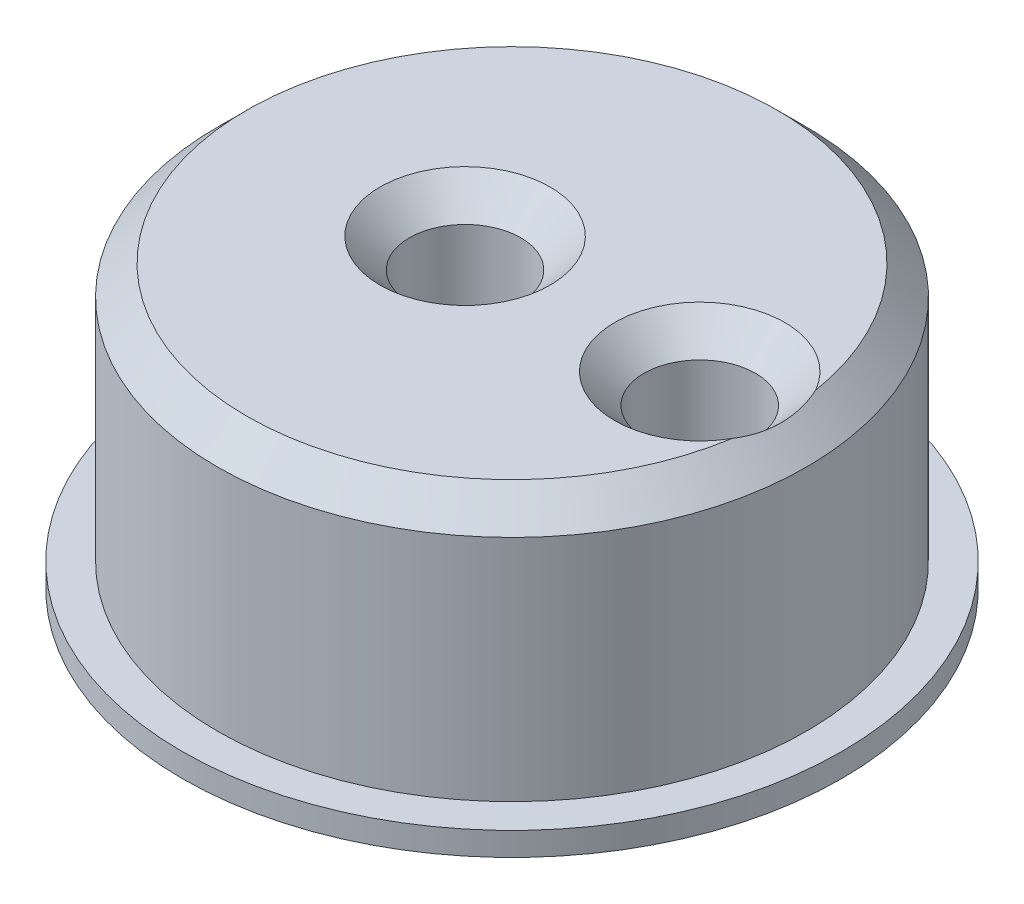
ISO-10303-21;
HEADER;
FILE_DESCRIPTION(('STEP AP214'),'2;1');
FILE_NAME('part.step','',(''),(''),'','','');
FILE_SCHEMA(('AUTOMOTIVE_DESIGN { 1 0 10303 214 1 1 1 1 }'));
ENDSEC;
DATA;
#1=APPLICATION_CONTEXT('core data for automotive mechanical design processes');
#2=APPLICATION_PROTOCOL_DEFINITION('international standard','automotive_design',2000,#1);
#3=PRODUCT_CONTEXT('',#1,'mechanical');
#4=PRODUCT('Part','Part','',(#3));
#5=PRODUCT_RELATED_PRODUCT_CATEGORY('part','',(#4));
#6=PRODUCT_DEFINITION_FORMATION('','',#4);
#7=PRODUCT_DEFINITION_CONTEXT('part definition',#1,'design');
#8=PRODUCT_DEFINITION('design','',#6,#7);
#9=PRODUCT_DEFINITION_SHAPE('','',#8);
#10=(LENGTH_UNIT() NAMED_UNIT(*) SI_UNIT(.MILLI.,.METRE.));
#11=(NAMED_UNIT(*) PLANE_ANGLE_UNIT() SI_UNIT($,.RADIAN.));
#12=(NAMED_UNIT(*) SI_UNIT($,.STERADIAN.) SOLID_ANGLE_UNIT());
#13=UNCERTAINTY_MEASURE_WITH_UNIT(LENGTH_MEASURE(1.E-05),#10,'distance_accuracy_value','');
#14=(GEOMETRIC_REPRESENTATION_CONTEXT(3) GLOBAL_UNCERTAINTY_ASSIGNED_CONTEXT((#13)) GLOBAL_UNIT_ASSIGNED_CONTEXT((#10,
#11,#12)) REPRESENTATION_CONTEXT('',''));
#15=CARTESIAN_POINT('',(0.,0.,0.));
#16=DIRECTION('',(0.,0.,1.));
#17=DIRECTION('',(1.,0.,0.));
#18=AXIS2_PLACEMENT_3D('',#15,#16,#17);
#19=CARTESIAN_POINT('',(0.,4.4,0.));
#20=DIRECTION('',(0.,1.,0.));
#21=DIRECTION('',(0.,0.,1.));
#22=AXIS2_PLACEMENT_3D('',#19,#20,#21);
#23=PLANE('',#22);
#24=CARTESIAN_POINT('',(-0.8,4.4,0.));
#25=DIRECTION('',(0.,1.,0.));
#26=DIRECTION('',(0.,0.,1.));
#27=AXIS2_PLACEMENT_3D('',#24,#25,#26);
#28=CIRCLE('',#27,1.45);
#29=CARTESIAN_POINT('',(-0.8,4.4,1.45));
#30=VERTEX_POINT('',#29);
#31=EDGE_CURVE('E52',#30,#30,#28,.F.);
#32=ORIENTED_EDGE('',*,*,#31,.T.);
#33=EDGE_LOOP('',(#32));
#34=FACE_BOUND('',#33,.T.);
#35=CARTESIAN_POINT('',(3.2,4.4,0.));
#36=DIRECTION('',(0.,1.,0.));
#37=DIRECTION('',(0.,0.,1.));
#38=AXIS2_PLACEMENT_3D('',#35,#36,#37);
#39=CIRCLE('',#38,1.45);
#40=CARTESIAN_POINT('',(3.2,4.4,1.45));
#41=VERTEX_POINT('',#40);
#42=CARTESIAN_POINT('',(4.463734375,4.4,-0.710967952472805));
#43=VERTEX_POINT('',#42);
#44=EDGE_CURVE('E71',#41,#43,#39,.F.);
#45=ORIENTED_EDGE('',*,*,#44,.T.);
#46=CARTESIAN_POINT('',(0.,4.4,0.));
#47=DIRECTION('',(0.,1.,0.));
#48=DIRECTION('',(0.,0.,1.));
#49=AXIS2_PLACEMENT_3D('',#46,#47,#48);
#50=CIRCLE('',#49,4.52);
#51=CARTESIAN_POINT('',(0.,4.4,4.52));
#52=VERTEX_POINT('',#51);
#53=EDGE_CURVE('E84',#43,#52,#50,.T.);
#54=ORIENTED_EDGE('',*,*,#53,.T.);
#55=CARTESIAN_POINT('',(0.,4.4,0.));
#56=DIRECTION('',(0.,1.,0.));
#57=DIRECTION('',(0.,0.,1.));
#58=AXIS2_PLACEMENT_3D('',#55,#56,#57);
#59=CIRCLE('',#58,4.52);
#60=CARTESIAN_POINT('',(4.463734375,4.4,0.710967952472805));
#61=VERTEX_POINT('',#60);
#62=EDGE_CURVE('E59',#52,#61,#59,.T.);
#63=ORIENTED_EDGE('',*,*,#62,.T.);
#64=CARTESIAN_POINT('',(3.2,4.4,0.));
#65=DIRECTION('',(0.,1.,0.));
#66=DIRECTION('',(0.,0.,1.));
#67=AXIS2_PLACEMENT_3D('',#64,#65,#66);
#68=CIRCLE('',#67,1.45);
#69=EDGE_CURVE('E69',#61,#41,#68,.F.);
#70=ORIENTED_EDGE('',*,*,#69,.T.);
#71=EDGE_LOOP('',(#45,#54,#63,#70));
#72=FACE_BOUND('',#71,.T.);
#73=ADVANCED_FACE('F37',(#34,#72),#23,.T.);
#74=CARTESIAN_POINT('',(0.,4.4,0.));
#75=DIRECTION('',(0.,-1.,0.));
#76=DIRECTION('',(0.,0.,-1.));
#77=AXIS2_PLACEMENT_3D('',#74,#75,#76);
#78=CYLINDRICAL_SURFACE('',#77,5.02);
#79=CARTESIAN_POINT('',(0.,3.9,0.));
#80=DIRECTION('',(0.,1.,0.));
#81=DIRECTION('',(0.,0.,1.));
#82=AXIS2_PLACEMENT_3D('',#79,#80,#81);
#83=CIRCLE('',#82,5.02);
#84=CARTESIAN_POINT('',(0.,3.9,5.02));
#85=VERTEX_POINT('',#84);
#86=EDGE_CURVE('E11',#85,#85,#83,.F.);
#87=ORIENTED_EDGE('',*,*,#86,.T.);
#88=EDGE_LOOP('',(#87));
#89=FACE_BOUND('',#88,.T.);
#90=CARTESIAN_POINT('',(0.,0.,0.));
#91=DIRECTION('',(0.,1.,0.));
#92=DIRECTION('',(0.,0.,1.));
#93=AXIS2_PLACEMENT_3D('',#90,#91,#92);
#94=CIRCLE('',#93,5.02);
#95=CARTESIAN_POINT('',(0.,0.,5.02));
#96=VERTEX_POINT('',#95);
#97=EDGE_CURVE('E111',#96,#96,#94,.T.);
#98=ORIENTED_EDGE('',*,*,#97,.T.);
#99=EDGE_LOOP('',(#98));
#100=FACE_BOUND('',#99,.T.);
#101=ADVANCED_FACE('F142',(#89,#100),#78,.T.);
#102=CARTESIAN_POINT('',(3.2,4.4,0.));
#103=DIRECTION('',(0.,-1.,0.));
#104=DIRECTION('',(0.,0.,-1.));
#105=AXIS2_PLACEMENT_3D('',#102,#103,#104);
#106=CYLINDRICAL_SURFACE('',#105,0.95);
#107=CARTESIAN_POINT('',(3.2,0.1,0.));
#108=DIRECTION('',(0.,-1.,0.));
#109=DIRECTION('',(0.,0.,-1.));
#110=AXIS2_PLACEMENT_3D('',#107,#108,#109);
#111=CIRCLE('',#110,0.95);
#112=CARTESIAN_POINT('',(3.2,0.1,-0.95));
#113=VERTEX_POINT('',#112);
#114=EDGE_CURVE('E105',#113,#113,#111,.T.);
#115=ORIENTED_EDGE('',*,*,#114,.T.);
#116=EDGE_LOOP('',(#115));
#117=FACE_BOUND('',#116,.T.);
#118=CARTESIAN_POINT('',(3.2,3.9,0.));
#119=DIRECTION('',(0.,1.,0.));
#120=DIRECTION('',(0.,0.,1.));
#121=AXIS2_PLACEMENT_3D('',#118,#119,#120);
#122=CIRCLE('',#121,0.95);
#123=CARTESIAN_POINT('',(3.2,3.9,0.95));
#124=VERTEX_POINT('',#123);
#125=EDGE_CURVE('E108',#124,#124,#122,.T.);
#126=ORIENTED_EDGE('',*,*,#125,.T.);
#127=EDGE_LOOP('',(#126));
#128=FACE_BOUND('',#127,.T.);
#129=ADVANCED_FACE('F147',(#117,#128),#106,.F.);
#130=CARTESIAN_POINT('',(-0.8,4.4,0.));
#131=DIRECTION('',(0.,-1.,0.));
#132=DIRECTION('',(0.,0.,-1.));
#133=AXIS2_PLACEMENT_3D('',#130,#131,#132);
#134=CYLINDRICAL_SURFACE('',#133,0.95);
#135=CARTESIAN_POINT('',(-0.8,0.100000000000002,0.));
#136=DIRECTION('',(0.,-1.,0.));
#137=DIRECTION('',(0.,0.,-1.));
#138=AXIS2_PLACEMENT_3D('',#135,#136,#137);
#139=CIRCLE('',#138,0.95);
#140=CARTESIAN_POINT('',(-0.8,0.100000000000002,-0.95));
#141=VERTEX_POINT('',#140);
#142=EDGE_CURVE('E76',#141,#141,#139,.T.);
#143=ORIENTED_EDGE('',*,*,#142,.T.);
#144=EDGE_LOOP('',(#143));
#145=FACE_BOUND('',#144,.T.);
#146=CARTESIAN_POINT('',(-0.8,3.9,0.));
#147=DIRECTION('',(0.,1.,0.));
#148=DIRECTION('',(0.,0.,1.));
#149=AXIS2_PLACEMENT_3D('',#146,#147,#148);
#150=CIRCLE('',#149,0.95);
#151=CARTESIAN_POINT('',(-0.8,3.9,0.950000000000001));
#152=VERTEX_POINT('',#151);
#153=EDGE_CURVE('E79',#152,#152,#150,.T.);
#154=ORIENTED_EDGE('',*,*,#153,.T.);
#155=EDGE_LOOP('',(#154));
#156=FACE_BOUND('',#155,.T.);
#157=ADVANCED_FACE('F137',(#145,#156),#134,.F.);
#158=CARTESIAN_POINT('',(0.,-0.4,0.));
#159=DIRECTION('',(0.,-1.,0.));
#160=DIRECTION('',(0.,0.,-1.));
#161=AXIS2_PLACEMENT_3D('',#158,#159,#160);
#162=PLANE('',#161);
#163=CARTESIAN_POINT('',(3.2,-0.4,0.));
#164=DIRECTION('',(0.,-1.,0.));
#165=DIRECTION('',(0.,0.,-1.));
#166=AXIS2_PLACEMENT_3D('',#163,#164,#165);
#167=CIRCLE('',#166,1.45);
#168=CARTESIAN_POINT('',(3.2,-0.4,-1.45));
#169=VERTEX_POINT('',#168);
#170=EDGE_CURVE('E98',#169,#169,#167,.F.);
#171=ORIENTED_EDGE('',*,*,#170,.T.);
#172=EDGE_LOOP('',(#171));
#173=FACE_BOUND('',#172,.T.);
#174=CARTESIAN_POINT('',(-0.8,-0.4,0.));
#175=DIRECTION('',(0.,-1.,0.));
#176=DIRECTION('',(0.,0.,-1.));
#177=AXIS2_PLACEMENT_3D('',#174,#175,#176);
#178=CIRCLE('',#177,1.45);
#179=CARTESIAN_POINT('',(-0.8,-0.4,-1.45));
#180=VERTEX_POINT('',#179);
#181=EDGE_CURVE('E100',#180,#180,#178,.F.);
#182=ORIENTED_EDGE('',*,*,#181,.T.);
#183=EDGE_LOOP('',(#182));
#184=FACE_BOUND('',#183,.T.);
#185=CARTESIAN_POINT('',(0.,-0.4,0.));
#186=DIRECTION('',(0.,-1.,0.));
#187=DIRECTION('',(0.,0.,-1.));
#188=AXIS2_PLACEMENT_3D('',#185,#186,#187);
#189=CIRCLE('',#188,5.62);
#190=CARTESIAN_POINT('',(0.,-0.4,-5.62));
#191=VERTEX_POINT('',#190);
#192=EDGE_CURVE('E114',#191,#191,#189,.T.);
#193=ORIENTED_EDGE('',*,*,#192,.T.);
#194=EDGE_LOOP('',(#193));
#195=FACE_BOUND('',#194,.T.);
#196=ADVANCED_FACE('F121',(#173,#184,#195),#162,.T.);
#197=CARTESIAN_POINT('',(0.,0.,0.));
#198=DIRECTION('',(0.,-1.,0.));
#199=DIRECTION('',(0.,0.,-1.));
#200=AXIS2_PLACEMENT_3D('',#197,#198,#199);
#201=PLANE('',#200);
#202=ORIENTED_EDGE('',*,*,#97,.F.);
#203=EDGE_LOOP('',(#202));
#204=FACE_BOUND('',#203,.T.);
#205=CARTESIAN_POINT('',(0.,0.,0.));
#206=DIRECTION('',(0.,-1.,0.));
#207=DIRECTION('',(0.,0.,-1.));
#208=AXIS2_PLACEMENT_3D('',#205,#206,#207);
#209=CIRCLE('',#208,5.62);
#210=CARTESIAN_POINT('',(0.,0.,-5.62));
#211=VERTEX_POINT('',#210);
#212=EDGE_CURVE('E115',#211,#211,#209,.T.);
#213=ORIENTED_EDGE('',*,*,#212,.F.);
#214=EDGE_LOOP('',(#213));
#215=FACE_BOUND('',#214,.T.);
#216=ADVANCED_FACE('F127',(#204,#215),#201,.F.);
#217=CARTESIAN_POINT('',(0.,-0.4,0.));
#218=DIRECTION('',(0.,1.,0.));
#219=DIRECTION('',(0.,0.,1.));
#220=AXIS2_PLACEMENT_3D('',#217,#218,#219);
#221=CYLINDRICAL_SURFACE('',#220,5.62);
#222=ORIENTED_EDGE('',*,*,#192,.F.);
#223=EDGE_LOOP('',(#222));
#224=FACE_BOUND('',#223,.T.);
#225=ORIENTED_EDGE('',*,*,#212,.T.);
#226=EDGE_LOOP('',(#225));
#227=FACE_BOUND('',#226,.T.);
#228=ADVANCED_FACE('F123',(#224,#227),#221,.T.);
#229=CARTESIAN_POINT('',(3.2,0.1,0.));
#230=DIRECTION('',(0.,-1.,0.));
#231=DIRECTION('',(0.,0.,-1.));
#232=AXIS2_PLACEMENT_3D('',#229,#230,#231);
#233=CONICAL_SURFACE('',#232,0.95,0.785398163397448);
#234=ORIENTED_EDGE('',*,*,#170,.F.);
#235=EDGE_LOOP('',(#234));
#236=FACE_BOUND('',#235,.T.);
#237=ORIENTED_EDGE('',*,*,#114,.F.);
#238=EDGE_LOOP('',(#237));
#239=FACE_BOUND('',#238,.T.);
#240=ADVANCED_FACE('F126',(#236,#239),#233,.F.);
#241=CARTESIAN_POINT('',(-0.8,0.100000000000002,0.));
#242=DIRECTION('',(0.,-1.,0.));
#243=DIRECTION('',(0.,0.,-1.));
#244=AXIS2_PLACEMENT_3D('',#241,#242,#243);
#245=CONICAL_SURFACE('',#244,0.95,0.78539816339745);
#246=ORIENTED_EDGE('',*,*,#181,.F.);
#247=EDGE_LOOP('',(#246));
#248=FACE_BOUND('',#247,.T.);
#249=ORIENTED_EDGE('',*,*,#142,.F.);
#250=EDGE_LOOP('',(#249));
#251=FACE_BOUND('',#250,.T.);
#252=ADVANCED_FACE('F93',(#248,#251),#245,.F.);
#253=CARTESIAN_POINT('',(-0.8,3.9,0.));
#254=DIRECTION('',(0.,1.,0.));
#255=DIRECTION('',(0.,0.,1.));
#256=AXIS2_PLACEMENT_3D('',#253,#254,#255);
#257=CONICAL_SURFACE('',#256,0.95,0.785398163397448);
#258=ORIENTED_EDGE('',*,*,#31,.F.);
#259=EDGE_LOOP('',(#258));
#260=FACE_BOUND('',#259,.T.);
#261=ORIENTED_EDGE('',*,*,#153,.F.);
#262=EDGE_LOOP('',(#261));
#263=FACE_BOUND('',#262,.T.);
#264=ADVANCED_FACE('F90',(#260,#263),#257,.F.);
#265=CARTESIAN_POINT('',(3.2,3.9,0.));
#266=DIRECTION('',(0.,1.,0.));
#267=DIRECTION('',(0.,0.,1.));
#268=AXIS2_PLACEMENT_3D('',#265,#266,#267);
#269=CONICAL_SURFACE('',#268,0.95,0.78539816339745);
#270=ORIENTED_EDGE('',*,*,#125,.F.);
#271=EDGE_LOOP('',(#270));
#272=FACE_BOUND('',#271,.T.);
#273=CARTESIAN_POINT('',(4.46336124999939,4.40020000000033,-0.712038195605351));
#274=CARTESIAN_POINT('',(4.48136154746672,4.39055159938089,-0.660479894614825));
#275=CARTESIAN_POINT('',(4.49751126197679,4.38189513599321,-0.608078459470944));
#276=CARTESIAN_POINT('',(4.52590189005661,4.36667737888327,-0.501907485406044));
#277=CARTESIAN_POINT('',(4.53814114896073,4.36011697208394,-0.448137377709054));
#278=CARTESIAN_POINT('',(4.55848439471759,4.34921271974678,-0.339608770913308));
#279=CARTESIAN_POINT('',(4.56658970587056,4.34486816436625,-0.284850594167523));
#280=CARTESIAN_POINT('',(4.57853390585068,4.33846591310465,-0.174763309843387));
#281=CARTESIAN_POINT('',(4.58237373988418,4.33640771058031,-0.119434331495355));
#282=CARTESIAN_POINT('',(4.58731754306112,4.33375776593147,0.0453206430818813));
#283=CARTESIAN_POINT('',(4.58213704994516,4.33653457997052,0.155068695723513));
#284=CARTESIAN_POINT('',(4.5551709232223,4.3509887852185,0.371649047806405));
#285=CARTESIAN_POINT('',(4.53342112456345,4.36264696841649,0.478487124961762));
#286=CARTESIAN_POINT('',(4.49802404192863,4.38162027903149,0.604301625872806));
#287=CARTESIAN_POINT('',(4.49153754551662,4.3850971280424,0.62604893643519));
#288=CARTESIAN_POINT('',(4.47792550009704,4.39239336680695,0.669254584748194));
#289=CARTESIAN_POINT('',(4.47080074437294,4.39621233135004,0.690713244111516));
#290=CARTESIAN_POINT('',(4.46336124999939,4.40020000000033,0.712038195605354));
#291=B_SPLINE_CURVE_WITH_KNOTS('',3,(#273,#274,#275,#276,#277,#278,#279,#280,#281,#282,#283,
#284,#285,#286,#287,#288,#289,#290),.UNSPECIFIED.,.F.,.F.,(4,2,2,2,2,2,2,2,4),(0.,
0.166337306027612,0.3327449028996,0.499099157962062,0.665416542475963,0.993351829641265,
1.32057988746438,1.38945078827674,1.4582372475501),.UNSPECIFIED.);
#292=EDGE_CURVE('E42',#43,#61,#291,.T.);
#293=ORIENTED_EDGE('',*,*,#292,.F.);
#294=ORIENTED_EDGE('',*,*,#44,.F.);
#295=ORIENTED_EDGE('',*,*,#69,.F.);
#296=EDGE_LOOP('',(#293,#294,#295));
#297=FACE_BOUND('',#296,.T.);
#298=ADVANCED_FACE('F75',(#272,#297),#269,.F.);
#299=CARTESIAN_POINT('',(0.,4.4,0.));
#300=DIRECTION('',(0.,-1.,0.));
#301=DIRECTION('',(0.,0.,-1.));
#302=AXIS2_PLACEMENT_3D('',#299,#300,#301);
#303=CONICAL_SURFACE('',#302,4.52,0.785398163397448);
#304=ORIENTED_EDGE('',*,*,#86,.F.);
#305=EDGE_LOOP('',(#304));
#306=FACE_BOUND('',#305,.T.);
#307=ORIENTED_EDGE('',*,*,#53,.F.);
#308=ORIENTED_EDGE('',*,*,#292,.T.);
#309=ORIENTED_EDGE('',*,*,#62,.F.);
#310=EDGE_LOOP('',(#307,#308,#309));
#311=FACE_BOUND('',#310,.T.);
#312=ADVANCED_FACE('F40',(#306,#311),#303,.T.);
#313=CLOSED_SHELL('',(#73,#101,#129,#157,#196,#216,#228,#240,#252,#264,#298,#312));
#314=MANIFOLD_SOLID_BREP('B2',#313);
#315=ADVANCED_BREP_SHAPE_REPRESENTATION('',(#18,#314),#14);
#316=SHAPE_DEFINITION_REPRESENTATION(#9,#315);
ENDSEC;
END-ISO-10303-21;
